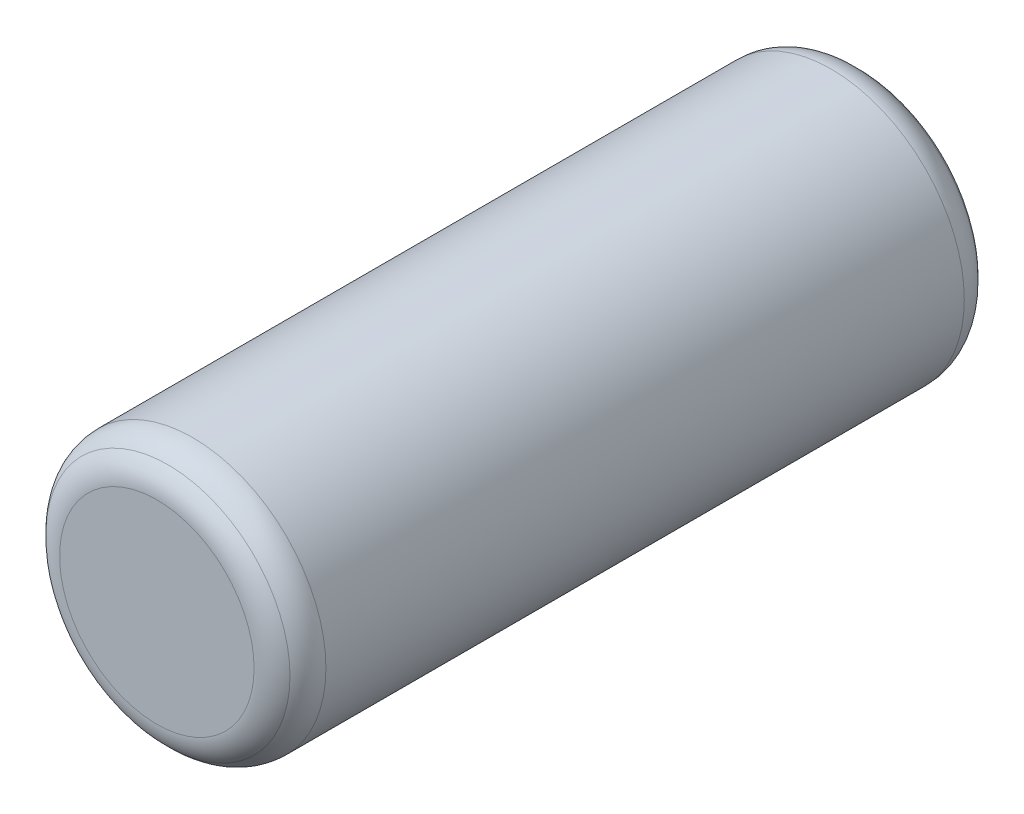
ISO-10303-21;
HEADER;
FILE_DESCRIPTION(('STEP AP214'),'2;1');
FILE_NAME('part.step','',(''),(''),'','','');
FILE_SCHEMA(('AUTOMOTIVE_DESIGN { 1 0 10303 214 1 1 1 1 }'));
ENDSEC;
DATA;
#1=APPLICATION_CONTEXT('core data for automotive mechanical design processes');
#2=APPLICATION_PROTOCOL_DEFINITION('international standard','automotive_design',2000,#1);
#3=PRODUCT_CONTEXT('',#1,'mechanical');
#4=PRODUCT('Part','Part','',(#3));
#5=PRODUCT_RELATED_PRODUCT_CATEGORY('part','',(#4));
#6=PRODUCT_DEFINITION_FORMATION('','',#4);
#7=PRODUCT_DEFINITION_CONTEXT('part definition',#1,'design');
#8=PRODUCT_DEFINITION('design','',#6,#7);
#9=PRODUCT_DEFINITION_SHAPE('','',#8);
#10=(LENGTH_UNIT() NAMED_UNIT(*) SI_UNIT(.MILLI.,.METRE.));
#11=(NAMED_UNIT(*) PLANE_ANGLE_UNIT() SI_UNIT($,.RADIAN.));
#12=(NAMED_UNIT(*) SI_UNIT($,.STERADIAN.) SOLID_ANGLE_UNIT());
#13=UNCERTAINTY_MEASURE_WITH_UNIT(LENGTH_MEASURE(1.E-05),#10,'distance_accuracy_value','');
#14=(GEOMETRIC_REPRESENTATION_CONTEXT(3) GLOBAL_UNCERTAINTY_ASSIGNED_CONTEXT((#13)) GLOBAL_UNIT_ASSIGNED_CONTEXT((#10,
#11,#12)) REPRESENTATION_CONTEXT('',''));
#15=CARTESIAN_POINT('',(0.,0.,0.));
#16=DIRECTION('',(0.,0.,1.));
#17=DIRECTION('',(1.,0.,0.));
#18=AXIS2_PLACEMENT_3D('',#15,#16,#17);
#19=CARTESIAN_POINT('',(0.,0.,-15.5));
#20=DIRECTION('',(0.,0.,1.));
#21=DIRECTION('',(1.,0.,0.));
#22=AXIS2_PLACEMENT_3D('',#19,#20,#21);
#23=CYLINDRICAL_SURFACE('',#22,3.);
#24=CARTESIAN_POINT('',(0.,0.,-14.9409830056251));
#25=DIRECTION('',(0.,0.,-1.));
#26=DIRECTION('',(-1.,0.,0.));
#27=AXIS2_PLACEMENT_3D('',#24,#25,#26);
#28=CIRCLE('',#27,3.);
#29=CARTESIAN_POINT('',(-3.,0.,-14.9409830056251));
#30=VERTEX_POINT('',#29);
#31=EDGE_CURVE('E11',#30,#30,#28,.F.);
#32=ORIENTED_EDGE('',*,*,#31,.T.);
#33=EDGE_LOOP('',(#32));
#34=FACE_BOUND('',#33,.T.);
#35=CARTESIAN_POINT('',(0.,0.,-0.559016994374948));
#36=DIRECTION('',(0.,0.,1.));
#37=DIRECTION('',(1.,0.,0.));
#38=AXIS2_PLACEMENT_3D('',#35,#36,#37);
#39=CIRCLE('',#38,3.);
#40=CARTESIAN_POINT('',(3.,0.,-0.559016994374948));
#41=VERTEX_POINT('',#40);
#42=EDGE_CURVE('E72',#41,#41,#39,.F.);
#43=ORIENTED_EDGE('',*,*,#42,.T.);
#44=EDGE_LOOP('',(#43));
#45=FACE_BOUND('',#44,.T.);
#46=ADVANCED_FACE('F39',(#34,#45),#23,.T.);
#47=CARTESIAN_POINT('',(0.,0.,0.25));
#48=DIRECTION('',(0.,0.,1.));
#49=DIRECTION('',(1.,0.,0.));
#50=AXIS2_PLACEMENT_3D('',#47,#48,#49);
#51=PLANE('',#50);
#52=CARTESIAN_POINT('',(0.,0.,0.25));
#53=DIRECTION('',(0.,0.,1.));
#54=DIRECTION('',(1.,0.,0.));
#55=AXIS2_PLACEMENT_3D('',#52,#53,#54);
#56=CIRCLE('',#55,2.19098300562505);
#57=CARTESIAN_POINT('',(2.19098300562505,0.,0.25));
#58=VERTEX_POINT('',#57);
#59=EDGE_CURVE('E68',#58,#58,#56,.T.);
#60=ORIENTED_EDGE('',*,*,#59,.T.);
#61=EDGE_LOOP('',(#60));
#62=FACE_BOUND('',#61,.T.);
#63=ADVANCED_FACE('F90',(#62),#51,.T.);
#64=CARTESIAN_POINT('',(0.,0.,-0.5));
#65=DIRECTION('',(0.,0.,-1.));
#66=DIRECTION('',(-1.,0.,0.));
#67=AXIS2_PLACEMENT_3D('',#64,#65,#66);
#68=TOROIDAL_SURFACE('',#67,2.19098300562505,0.75);
#69=ORIENTED_EDGE('',*,*,#59,.F.);
#70=EDGE_LOOP('',(#69));
#71=FACE_BOUND('',#70,.T.);
#72=CARTESIAN_POINT('',(0.,0.,0.));
#73=DIRECTION('',(0.,0.,1.));
#74=DIRECTION('',(1.,0.,0.));
#75=AXIS2_PLACEMENT_3D('',#72,#73,#74);
#76=CIRCLE('',#75,2.75);
#77=CARTESIAN_POINT('',(2.75,0.,0.));
#78=VERTEX_POINT('',#77);
#79=EDGE_CURVE('E62',#78,#78,#76,.F.);
#80=ORIENTED_EDGE('',*,*,#79,.F.);
#81=EDGE_LOOP('',(#80));
#82=FACE_BOUND('',#81,.T.);
#83=ADVANCED_FACE('F85',(#71,#82),#68,.T.);
#84=CARTESIAN_POINT('',(0.,0.,-0.559016994374948));
#85=DIRECTION('',(0.,0.,1.));
#86=DIRECTION('',(1.,0.,0.));
#87=AXIS2_PLACEMENT_3D('',#84,#85,#86);
#88=TOROIDAL_SURFACE('',#87,2.25,0.75);
#89=ORIENTED_EDGE('',*,*,#42,.F.);
#90=EDGE_LOOP('',(#89));
#91=FACE_BOUND('',#90,.T.);
#92=ORIENTED_EDGE('',*,*,#79,.T.);
#93=EDGE_LOOP('',(#92));
#94=FACE_BOUND('',#93,.T.);
#95=ADVANCED_FACE('F81',(#91,#94),#88,.T.);
#96=CARTESIAN_POINT('',(0.,0.,-15.75));
#97=DIRECTION('',(0.,0.,-1.));
#98=DIRECTION('',(-1.,0.,0.));
#99=AXIS2_PLACEMENT_3D('',#96,#97,#98);
#100=PLANE('',#99);
#101=CARTESIAN_POINT('',(0.,0.,-15.75));
#102=DIRECTION('',(0.,0.,-1.));
#103=DIRECTION('',(-1.,0.,0.));
#104=AXIS2_PLACEMENT_3D('',#101,#102,#103);
#105=CIRCLE('',#104,2.19098300562505);
#106=CARTESIAN_POINT('',(-2.19098300562505,0.,-15.75));
#107=VERTEX_POINT('',#106);
#108=EDGE_CURVE('E50',#107,#107,#105,.T.);
#109=ORIENTED_EDGE('',*,*,#108,.T.);
#110=EDGE_LOOP('',(#109));
#111=FACE_BOUND('',#110,.T.);
#112=ADVANCED_FACE('F84',(#111),#100,.T.);
#113=CARTESIAN_POINT('',(0.,0.,-14.9409830056251));
#114=DIRECTION('',(0.,0.,-1.));
#115=DIRECTION('',(-1.,0.,0.));
#116=AXIS2_PLACEMENT_3D('',#113,#114,#115);
#117=TOROIDAL_SURFACE('',#116,2.25,0.75);
#118=ORIENTED_EDGE('',*,*,#31,.F.);
#119=EDGE_LOOP('',(#118));
#120=FACE_BOUND('',#119,.T.);
#121=CARTESIAN_POINT('',(0.,0.,-15.5));
#122=DIRECTION('',(0.,0.,-1.));
#123=DIRECTION('',(-1.,0.,0.));
#124=AXIS2_PLACEMENT_3D('',#121,#122,#123);
#125=CIRCLE('',#124,2.75);
#126=CARTESIAN_POINT('',(2.75,0.,-15.5));
#127=VERTEX_POINT('',#126);
#128=CARTESIAN_POINT('',(-2.75,0.,-15.5));
#129=VERTEX_POINT('',#128);
#130=EDGE_CURVE('E43',#127,#129,#125,.T.);
#131=ORIENTED_EDGE('',*,*,#130,.F.);
#132=CARTESIAN_POINT('',(0.,0.,-15.5));
#133=DIRECTION('',(0.,0.,-1.));
#134=DIRECTION('',(-1.,0.,0.));
#135=AXIS2_PLACEMENT_3D('',#132,#133,#134);
#136=CIRCLE('',#135,2.75);
#137=EDGE_CURVE('E60',#129,#127,#136,.T.);
#138=ORIENTED_EDGE('',*,*,#137,.F.);
#139=EDGE_LOOP('',(#131,#138));
#140=FACE_BOUND('',#139,.T.);
#141=ADVANCED_FACE('F41',(#120,#140),#117,.T.);
#142=CARTESIAN_POINT('',(0.,0.,-15.));
#143=DIRECTION('',(0.,0.,1.));
#144=DIRECTION('',(1.,0.,0.));
#145=AXIS2_PLACEMENT_3D('',#142,#143,#144);
#146=TOROIDAL_SURFACE('',#145,2.19098300562505,0.75);
#147=ORIENTED_EDGE('',*,*,#137,.T.);
#148=ORIENTED_EDGE('',*,*,#130,.T.);
#149=EDGE_LOOP('',(#147,#148));
#150=FACE_BOUND('',#149,.T.);
#151=ORIENTED_EDGE('',*,*,#108,.F.);
#152=EDGE_LOOP('',(#151));
#153=FACE_BOUND('',#152,.T.);
#154=ADVANCED_FACE('F58',(#150,#153),#146,.T.);
#155=CLOSED_SHELL('',(#46,#63,#83,#95,#112,#141,#154));
#156=MANIFOLD_SOLID_BREP('B2',#155);
#157=ADVANCED_BREP_SHAPE_REPRESENTATION('',(#18,#156),#14);
#158=SHAPE_DEFINITION_REPRESENTATION(#9,#157);
ENDSEC;
END-ISO-10303-21;
